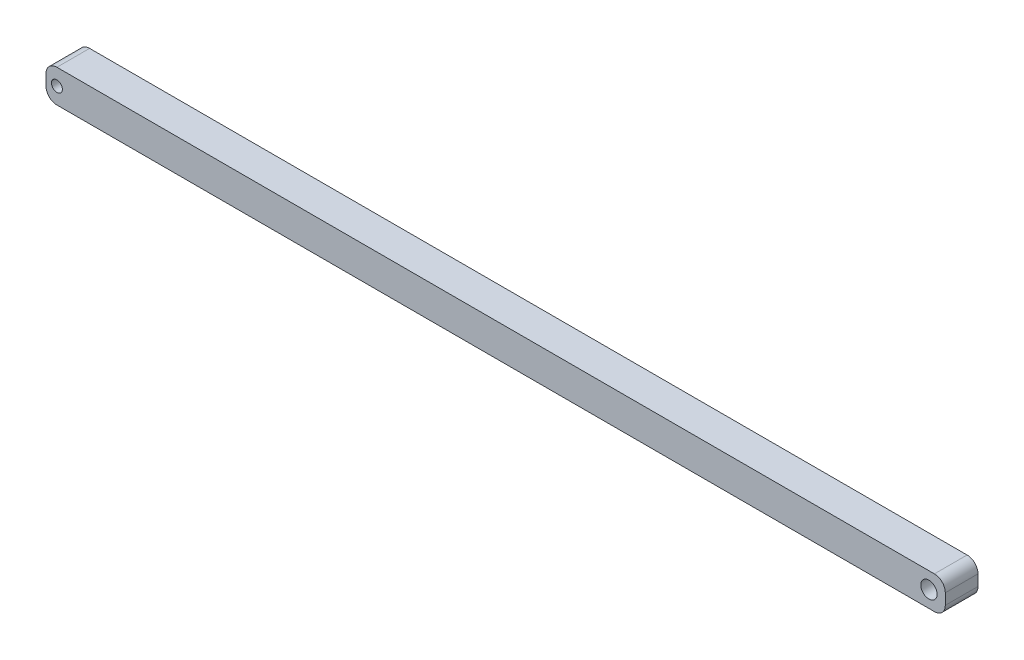
ISO-10303-21;
HEADER;
FILE_DESCRIPTION(('STEP AP214'),'2;1');
FILE_NAME('part.step','',(''),(''),'','','');
FILE_SCHEMA(('AUTOMOTIVE_DESIGN { 1 0 10303 214 1 1 1 1 }'));
ENDSEC;
DATA;
#1=APPLICATION_CONTEXT('core data for automotive mechanical design processes');
#2=APPLICATION_PROTOCOL_DEFINITION('international standard','automotive_design',2000,#1);
#3=PRODUCT_CONTEXT('',#1,'mechanical');
#4=PRODUCT('Part','Part','',(#3));
#5=PRODUCT_RELATED_PRODUCT_CATEGORY('part','',(#4));
#6=PRODUCT_DEFINITION_FORMATION('','',#4);
#7=PRODUCT_DEFINITION_CONTEXT('part definition',#1,'design');
#8=PRODUCT_DEFINITION('design','',#6,#7);
#9=PRODUCT_DEFINITION_SHAPE('','',#8);
#10=(LENGTH_UNIT() NAMED_UNIT(*) SI_UNIT(.MILLI.,.METRE.));
#11=(NAMED_UNIT(*) PLANE_ANGLE_UNIT() SI_UNIT($,.RADIAN.));
#12=(NAMED_UNIT(*) SI_UNIT($,.STERADIAN.) SOLID_ANGLE_UNIT());
#13=UNCERTAINTY_MEASURE_WITH_UNIT(LENGTH_MEASURE(1.E-05),#10,'distance_accuracy_value','');
#14=(GEOMETRIC_REPRESENTATION_CONTEXT(3) GLOBAL_UNCERTAINTY_ASSIGNED_CONTEXT((#13)) GLOBAL_UNIT_ASSIGNED_CONTEXT((#10,
#11,#12)) REPRESENTATION_CONTEXT('',''));
#15=CARTESIAN_POINT('',(0.,0.,0.));
#16=DIRECTION('',(0.,0.,1.));
#17=DIRECTION('',(1.,0.,0.));
#18=AXIS2_PLACEMENT_3D('',#15,#16,#17);
#19=CARTESIAN_POINT('',(0.,0.,6.));
#20=DIRECTION('',(1.,0.,0.));
#21=DIRECTION('',(0.,0.,-1.));
#22=AXIS2_PLACEMENT_3D('',#19,#20,#21);
#23=PLANE('',#22);
#24=DIRECTION('',(0.,-1.,0.));
#25=VECTOR('',#24,1.);
#26=CARTESIAN_POINT('',(0.,0.,0.));
#27=LINE('',#26,#25);
#28=CARTESIAN_POINT('',(0.,4.,0.));
#29=VERTEX_POINT('',#28);
#30=CARTESIAN_POINT('',(0.,2.,0.));
#31=VERTEX_POINT('',#30);
#32=EDGE_CURVE('E138',#29,#31,#27,.T.);
#33=ORIENTED_EDGE('',*,*,#32,.T.);
#34=DIRECTION('',(0.,0.,-1.));
#35=VECTOR('',#34,1.);
#36=CARTESIAN_POINT('',(0.,2.,6.));
#37=LINE('',#36,#35);
#38=CARTESIAN_POINT('',(0.,2.,6.));
#39=VERTEX_POINT('',#38);
#40=EDGE_CURVE('E112',#31,#39,#37,.F.);
#41=ORIENTED_EDGE('',*,*,#40,.T.);
#42=DIRECTION('',(0.,-1.,0.));
#43=VECTOR('',#42,1.);
#44=CARTESIAN_POINT('',(0.,0.,6.));
#45=LINE('',#44,#43);
#46=CARTESIAN_POINT('',(0.,4.,6.));
#47=VERTEX_POINT('',#46);
#48=EDGE_CURVE('E152',#47,#39,#45,.T.);
#49=ORIENTED_EDGE('',*,*,#48,.F.);
#50=DIRECTION('',(0.,0.,-1.));
#51=VECTOR('',#50,1.);
#52=CARTESIAN_POINT('',(0.,4.,6.));
#53=LINE('',#52,#51);
#54=EDGE_CURVE('E118',#47,#29,#53,.T.);
#55=ORIENTED_EDGE('',*,*,#54,.T.);
#56=EDGE_LOOP('',(#33,#41,#49,#55));
#57=FACE_BOUND('',#56,.T.);
#58=ADVANCED_FACE('F39',(#57),#23,.F.);
#59=CARTESIAN_POINT('',(0.,0.,6.));
#60=DIRECTION('',(0.,1.,0.));
#61=DIRECTION('',(0.,0.,1.));
#62=AXIS2_PLACEMENT_3D('',#59,#60,#61);
#63=PLANE('',#62);
#64=DIRECTION('',(1.,0.,0.));
#65=VECTOR('',#64,1.);
#66=CARTESIAN_POINT('',(0.,0.,6.));
#67=LINE('',#66,#65);
#68=CARTESIAN_POINT('',(2.,0.,6.));
#69=VERTEX_POINT('',#68);
#70=CARTESIAN_POINT('',(163.,0.,6.));
#71=VERTEX_POINT('',#70);
#72=EDGE_CURVE('E128',#69,#71,#67,.T.);
#73=ORIENTED_EDGE('',*,*,#72,.F.);
#74=DIRECTION('',(0.,0.,-1.));
#75=VECTOR('',#74,1.);
#76=CARTESIAN_POINT('',(2.,0.,6.));
#77=LINE('',#76,#75);
#78=CARTESIAN_POINT('',(2.,0.,0.));
#79=VERTEX_POINT('',#78);
#80=EDGE_CURVE('E111',#69,#79,#77,.T.);
#81=ORIENTED_EDGE('',*,*,#80,.T.);
#82=DIRECTION('',(1.,0.,0.));
#83=VECTOR('',#82,1.);
#84=CARTESIAN_POINT('',(0.,0.,0.));
#85=LINE('',#84,#83);
#86=CARTESIAN_POINT('',(163.,0.,0.));
#87=VERTEX_POINT('',#86);
#88=EDGE_CURVE('E125',#79,#87,#85,.T.);
#89=ORIENTED_EDGE('',*,*,#88,.T.);
#90=DIRECTION('',(0.,0.,-1.));
#91=VECTOR('',#90,1.);
#92=CARTESIAN_POINT('',(163.,0.,6.));
#93=LINE('',#92,#91);
#94=EDGE_CURVE('E131',#87,#71,#93,.F.);
#95=ORIENTED_EDGE('',*,*,#94,.T.);
#96=EDGE_LOOP('',(#73,#81,#89,#95));
#97=FACE_BOUND('',#96,.T.);
#98=ADVANCED_FACE('F124',(#97),#63,.F.);
#99=CARTESIAN_POINT('',(165.,0.,6.));
#100=DIRECTION('',(-1.,0.,0.));
#101=DIRECTION('',(0.,0.,1.));
#102=AXIS2_PLACEMENT_3D('',#99,#100,#101);
#103=PLANE('',#102);
#104=DIRECTION('',(0.,1.,0.));
#105=VECTOR('',#104,1.);
#106=CARTESIAN_POINT('',(165.,0.,6.));
#107=LINE('',#106,#105);
#108=CARTESIAN_POINT('',(165.,2.,6.));
#109=VERTEX_POINT('',#108);
#110=CARTESIAN_POINT('',(165.,4.,6.));
#111=VERTEX_POINT('',#110);
#112=EDGE_CURVE('E190',#109,#111,#107,.T.);
#113=ORIENTED_EDGE('',*,*,#112,.F.);
#114=DIRECTION('',(0.,0.,-1.));
#115=VECTOR('',#114,1.);
#116=CARTESIAN_POINT('',(165.,2.,6.));
#117=LINE('',#116,#115);
#118=CARTESIAN_POINT('',(165.,2.,0.));
#119=VERTEX_POINT('',#118);
#120=EDGE_CURVE('E11',#109,#119,#117,.T.);
#121=ORIENTED_EDGE('',*,*,#120,.T.);
#122=DIRECTION('',(0.,1.,0.));
#123=VECTOR('',#122,1.);
#124=CARTESIAN_POINT('',(165.,0.,0.));
#125=LINE('',#124,#123);
#126=CARTESIAN_POINT('',(165.,4.,0.));
#127=VERTEX_POINT('',#126);
#128=EDGE_CURVE('E137',#119,#127,#125,.T.);
#129=ORIENTED_EDGE('',*,*,#128,.T.);
#130=DIRECTION('',(0.,0.,-1.));
#131=VECTOR('',#130,1.);
#132=CARTESIAN_POINT('',(165.,4.,6.));
#133=LINE('',#132,#131);
#134=EDGE_CURVE('E48',#127,#111,#133,.F.);
#135=ORIENTED_EDGE('',*,*,#134,.T.);
#136=EDGE_LOOP('',(#113,#121,#129,#135));
#137=FACE_BOUND('',#136,.T.);
#138=ADVANCED_FACE('F189',(#137),#103,.F.);
#139=CARTESIAN_POINT('',(0.,6.,6.));
#140=DIRECTION('',(0.,-1.,0.));
#141=DIRECTION('',(0.,0.,-1.));
#142=AXIS2_PLACEMENT_3D('',#139,#140,#141);
#143=PLANE('',#142);
#144=DIRECTION('',(-1.,0.,0.));
#145=VECTOR('',#144,1.);
#146=CARTESIAN_POINT('',(0.,6.,0.));
#147=LINE('',#146,#145);
#148=CARTESIAN_POINT('',(163.,6.,0.));
#149=VERTEX_POINT('',#148);
#150=CARTESIAN_POINT('',(2.,6.,0.));
#151=VERTEX_POINT('',#150);
#152=EDGE_CURVE('E144',#149,#151,#147,.T.);
#153=ORIENTED_EDGE('',*,*,#152,.T.);
#154=DIRECTION('',(0.,0.,-1.));
#155=VECTOR('',#154,1.);
#156=CARTESIAN_POINT('',(2.,6.,6.));
#157=LINE('',#156,#155);
#158=CARTESIAN_POINT('',(2.,6.,6.));
#159=VERTEX_POINT('',#158);
#160=EDGE_CURVE('E55',#151,#159,#157,.F.);
#161=ORIENTED_EDGE('',*,*,#160,.T.);
#162=DIRECTION('',(-1.,0.,0.));
#163=VECTOR('',#162,1.);
#164=CARTESIAN_POINT('',(0.,6.,6.));
#165=LINE('',#164,#163);
#166=CARTESIAN_POINT('',(163.,6.,6.));
#167=VERTEX_POINT('',#166);
#168=EDGE_CURVE('E154',#167,#159,#165,.T.);
#169=ORIENTED_EDGE('',*,*,#168,.F.);
#170=DIRECTION('',(0.,0.,-1.));
#171=VECTOR('',#170,1.);
#172=CARTESIAN_POINT('',(163.,6.,6.));
#173=LINE('',#172,#171);
#174=EDGE_CURVE('E178',#167,#149,#173,.T.);
#175=ORIENTED_EDGE('',*,*,#174,.T.);
#176=EDGE_LOOP('',(#153,#161,#169,#175));
#177=FACE_BOUND('',#176,.T.);
#178=ADVANCED_FACE('F200',(#177),#143,.F.);
#179=CARTESIAN_POINT('',(0.,0.,6.));
#180=DIRECTION('',(0.,0.,-1.));
#181=DIRECTION('',(-1.,0.,0.));
#182=AXIS2_PLACEMENT_3D('',#179,#180,#181);
#183=PLANE('',#182);
#184=CARTESIAN_POINT('',(162.,3.,6.));
#185=DIRECTION('',(0.,0.,1.));
#186=DIRECTION('',(1.,0.,0.));
#187=AXIS2_PLACEMENT_3D('',#184,#185,#186);
#188=CIRCLE('',#187,1.5);
#189=CARTESIAN_POINT('',(163.5,3.,6.));
#190=VERTEX_POINT('',#189);
#191=EDGE_CURVE('E238',#190,#190,#188,.T.);
#192=ORIENTED_EDGE('',*,*,#191,.F.);
#193=EDGE_LOOP('',(#192));
#194=FACE_BOUND('',#193,.T.);
#195=CARTESIAN_POINT('',(2.,3.,6.));
#196=DIRECTION('',(0.,0.,1.));
#197=DIRECTION('',(1.,0.,0.));
#198=AXIS2_PLACEMENT_3D('',#195,#196,#197);
#199=CIRCLE('',#198,1.);
#200=CARTESIAN_POINT('',(3.,3.,6.));
#201=VERTEX_POINT('',#200);
#202=EDGE_CURVE('E213',#201,#201,#199,.T.);
#203=ORIENTED_EDGE('',*,*,#202,.F.);
#204=EDGE_LOOP('',(#203));
#205=FACE_BOUND('',#204,.T.);
#206=ORIENTED_EDGE('',*,*,#48,.T.);
#207=CARTESIAN_POINT('',(2.,2.,6.));
#208=DIRECTION('',(0.,0.,-1.));
#209=DIRECTION('',(-1.,0.,0.));
#210=AXIS2_PLACEMENT_3D('',#207,#208,#209);
#211=CIRCLE('',#210,2.);
#212=EDGE_CURVE('E175',#39,#69,#211,.F.);
#213=ORIENTED_EDGE('',*,*,#212,.T.);
#214=ORIENTED_EDGE('',*,*,#72,.T.);
#215=CARTESIAN_POINT('',(163.,2.,6.));
#216=DIRECTION('',(0.,0.,-1.));
#217=DIRECTION('',(-1.,0.,0.));
#218=AXIS2_PLACEMENT_3D('',#215,#216,#217);
#219=CIRCLE('',#218,2.);
#220=EDGE_CURVE('E169',#71,#109,#219,.F.);
#221=ORIENTED_EDGE('',*,*,#220,.T.);
#222=ORIENTED_EDGE('',*,*,#112,.T.);
#223=CARTESIAN_POINT('',(163.,4.,6.));
#224=DIRECTION('',(0.,0.,-1.));
#225=DIRECTION('',(-1.,0.,0.));
#226=AXIS2_PLACEMENT_3D('',#223,#224,#225);
#227=CIRCLE('',#226,2.);
#228=EDGE_CURVE('E62',#111,#167,#227,.F.);
#229=ORIENTED_EDGE('',*,*,#228,.T.);
#230=ORIENTED_EDGE('',*,*,#168,.T.);
#231=CARTESIAN_POINT('',(2.,4.,6.));
#232=DIRECTION('',(0.,0.,-1.));
#233=DIRECTION('',(-1.,0.,0.));
#234=AXIS2_PLACEMENT_3D('',#231,#232,#233);
#235=CIRCLE('',#234,2.);
#236=EDGE_CURVE('E172',#159,#47,#235,.F.);
#237=ORIENTED_EDGE('',*,*,#236,.T.);
#238=EDGE_LOOP('',(#206,#213,#214,#221,#222,#229,#230,#237));
#239=FACE_BOUND('',#238,.T.);
#240=ADVANCED_FACE('F194',(#194,#205,#239),#183,.F.);
#241=CARTESIAN_POINT('',(0.,0.,0.));
#242=DIRECTION('',(0.,0.,-1.));
#243=DIRECTION('',(-1.,0.,0.));
#244=AXIS2_PLACEMENT_3D('',#241,#242,#243);
#245=PLANE('',#244);
#246=CARTESIAN_POINT('',(162.,3.,0.));
#247=DIRECTION('',(0.,0.,1.));
#248=DIRECTION('',(1.,0.,0.));
#249=AXIS2_PLACEMENT_3D('',#246,#247,#248);
#250=CIRCLE('',#249,1.5);
#251=CARTESIAN_POINT('',(163.5,3.,0.));
#252=VERTEX_POINT('',#251);
#253=EDGE_CURVE('E146',#252,#252,#250,.T.);
#254=ORIENTED_EDGE('',*,*,#253,.T.);
#255=EDGE_LOOP('',(#254));
#256=FACE_BOUND('',#255,.T.);
#257=CARTESIAN_POINT('',(2.,3.,0.));
#258=DIRECTION('',(0.,0.,1.));
#259=DIRECTION('',(1.,0.,0.));
#260=AXIS2_PLACEMENT_3D('',#257,#258,#259);
#261=CIRCLE('',#260,1.);
#262=CARTESIAN_POINT('',(3.,3.,0.));
#263=VERTEX_POINT('',#262);
#264=EDGE_CURVE('E245',#263,#263,#261,.T.);
#265=ORIENTED_EDGE('',*,*,#264,.T.);
#266=EDGE_LOOP('',(#265));
#267=FACE_BOUND('',#266,.T.);
#268=ORIENTED_EDGE('',*,*,#88,.F.);
#269=CARTESIAN_POINT('',(2.,2.,0.));
#270=DIRECTION('',(0.,0.,-1.));
#271=DIRECTION('',(-1.,0.,0.));
#272=AXIS2_PLACEMENT_3D('',#269,#270,#271);
#273=CIRCLE('',#272,2.);
#274=EDGE_CURVE('E107',#79,#31,#273,.T.);
#275=ORIENTED_EDGE('',*,*,#274,.T.);
#276=ORIENTED_EDGE('',*,*,#32,.F.);
#277=CARTESIAN_POINT('',(2.,4.,0.));
#278=DIRECTION('',(0.,0.,-1.));
#279=DIRECTION('',(-1.,0.,0.));
#280=AXIS2_PLACEMENT_3D('',#277,#278,#279);
#281=CIRCLE('',#280,2.);
#282=EDGE_CURVE('E119',#29,#151,#281,.T.);
#283=ORIENTED_EDGE('',*,*,#282,.T.);
#284=ORIENTED_EDGE('',*,*,#152,.F.);
#285=CARTESIAN_POINT('',(163.,4.,0.));
#286=DIRECTION('',(0.,0.,-1.));
#287=DIRECTION('',(-1.,0.,0.));
#288=AXIS2_PLACEMENT_3D('',#285,#286,#287);
#289=CIRCLE('',#288,2.);
#290=EDGE_CURVE('E130',#149,#127,#289,.T.);
#291=ORIENTED_EDGE('',*,*,#290,.T.);
#292=ORIENTED_EDGE('',*,*,#128,.F.);
#293=CARTESIAN_POINT('',(163.,2.,0.));
#294=DIRECTION('',(0.,0.,-1.));
#295=DIRECTION('',(-1.,0.,0.));
#296=AXIS2_PLACEMENT_3D('',#293,#294,#295);
#297=CIRCLE('',#296,2.);
#298=EDGE_CURVE('E135',#119,#87,#297,.T.);
#299=ORIENTED_EDGE('',*,*,#298,.T.);
#300=EDGE_LOOP('',(#268,#275,#276,#283,#284,#291,#292,#299));
#301=FACE_BOUND('',#300,.T.);
#302=ADVANCED_FACE('F133',(#256,#267,#301),#245,.T.);
#303=CARTESIAN_POINT('',(2.,3.,0.));
#304=DIRECTION('',(0.,0.,1.));
#305=DIRECTION('',(1.,0.,0.));
#306=AXIS2_PLACEMENT_3D('',#303,#304,#305);
#307=CYLINDRICAL_SURFACE('',#306,1.);
#308=ORIENTED_EDGE('',*,*,#264,.F.);
#309=EDGE_LOOP('',(#308));
#310=FACE_BOUND('',#309,.T.);
#311=ORIENTED_EDGE('',*,*,#202,.T.);
#312=EDGE_LOOP('',(#311));
#313=FACE_BOUND('',#312,.T.);
#314=ADVANCED_FACE('F256',(#310,#313),#307,.F.);
#315=CARTESIAN_POINT('',(162.,3.,0.));
#316=DIRECTION('',(0.,0.,1.));
#317=DIRECTION('',(1.,0.,0.));
#318=AXIS2_PLACEMENT_3D('',#315,#316,#317);
#319=CYLINDRICAL_SURFACE('',#318,1.5);
#320=ORIENTED_EDGE('',*,*,#253,.F.);
#321=EDGE_LOOP('',(#320));
#322=FACE_BOUND('',#321,.T.);
#323=ORIENTED_EDGE('',*,*,#191,.T.);
#324=EDGE_LOOP('',(#323));
#325=FACE_BOUND('',#324,.T.);
#326=ADVANCED_FACE('F280',(#322,#325),#319,.F.);
#327=CARTESIAN_POINT('',(2.,2.,6.));
#328=DIRECTION('',(0.,0.,-1.));
#329=DIRECTION('',(-1.,0.,0.));
#330=AXIS2_PLACEMENT_3D('',#327,#328,#329);
#331=CYLINDRICAL_SURFACE('',#330,2.);
#332=ORIENTED_EDGE('',*,*,#212,.F.);
#333=ORIENTED_EDGE('',*,*,#40,.F.);
#334=ORIENTED_EDGE('',*,*,#274,.F.);
#335=ORIENTED_EDGE('',*,*,#80,.F.);
#336=EDGE_LOOP('',(#332,#333,#334,#335));
#337=FACE_BOUND('',#336,.T.);
#338=ADVANCED_FACE('F110',(#337),#331,.T.);
#339=CARTESIAN_POINT('',(2.,4.,6.));
#340=DIRECTION('',(0.,0.,-1.));
#341=DIRECTION('',(-1.,0.,0.));
#342=AXIS2_PLACEMENT_3D('',#339,#340,#341);
#343=CYLINDRICAL_SURFACE('',#342,2.);
#344=ORIENTED_EDGE('',*,*,#236,.F.);
#345=ORIENTED_EDGE('',*,*,#160,.F.);
#346=ORIENTED_EDGE('',*,*,#282,.F.);
#347=ORIENTED_EDGE('',*,*,#54,.F.);
#348=EDGE_LOOP('',(#344,#345,#346,#347));
#349=FACE_BOUND('',#348,.T.);
#350=ADVANCED_FACE('F204',(#349),#343,.T.);
#351=CARTESIAN_POINT('',(163.,2.,6.));
#352=DIRECTION('',(0.,0.,-1.));
#353=DIRECTION('',(-1.,0.,0.));
#354=AXIS2_PLACEMENT_3D('',#351,#352,#353);
#355=CYLINDRICAL_SURFACE('',#354,2.);
#356=ORIENTED_EDGE('',*,*,#220,.F.);
#357=ORIENTED_EDGE('',*,*,#94,.F.);
#358=ORIENTED_EDGE('',*,*,#298,.F.);
#359=ORIENTED_EDGE('',*,*,#120,.F.);
#360=EDGE_LOOP('',(#356,#357,#358,#359));
#361=FACE_BOUND('',#360,.T.);
#362=ADVANCED_FACE('F282',(#361),#355,.T.);
#363=CARTESIAN_POINT('',(163.,4.,6.));
#364=DIRECTION('',(0.,0.,-1.));
#365=DIRECTION('',(-1.,0.,0.));
#366=AXIS2_PLACEMENT_3D('',#363,#364,#365);
#367=CYLINDRICAL_SURFACE('',#366,2.);
#368=ORIENTED_EDGE('',*,*,#228,.F.);
#369=ORIENTED_EDGE('',*,*,#134,.F.);
#370=ORIENTED_EDGE('',*,*,#290,.F.);
#371=ORIENTED_EDGE('',*,*,#174,.F.);
#372=EDGE_LOOP('',(#368,#369,#370,#371));
#373=FACE_BOUND('',#372,.T.);
#374=ADVANCED_FACE('F41',(#373),#367,.T.);
#375=CLOSED_SHELL('',(#58,#98,#138,#178,#240,#302,#314,#326,#338,#350,#362,#374));
#376=MANIFOLD_SOLID_BREP('B2',#375);
#377=ADVANCED_BREP_SHAPE_REPRESENTATION('',(#18,#376),#14);
#378=SHAPE_DEFINITION_REPRESENTATION(#9,#377);
ENDSEC;
END-ISO-10303-21;
